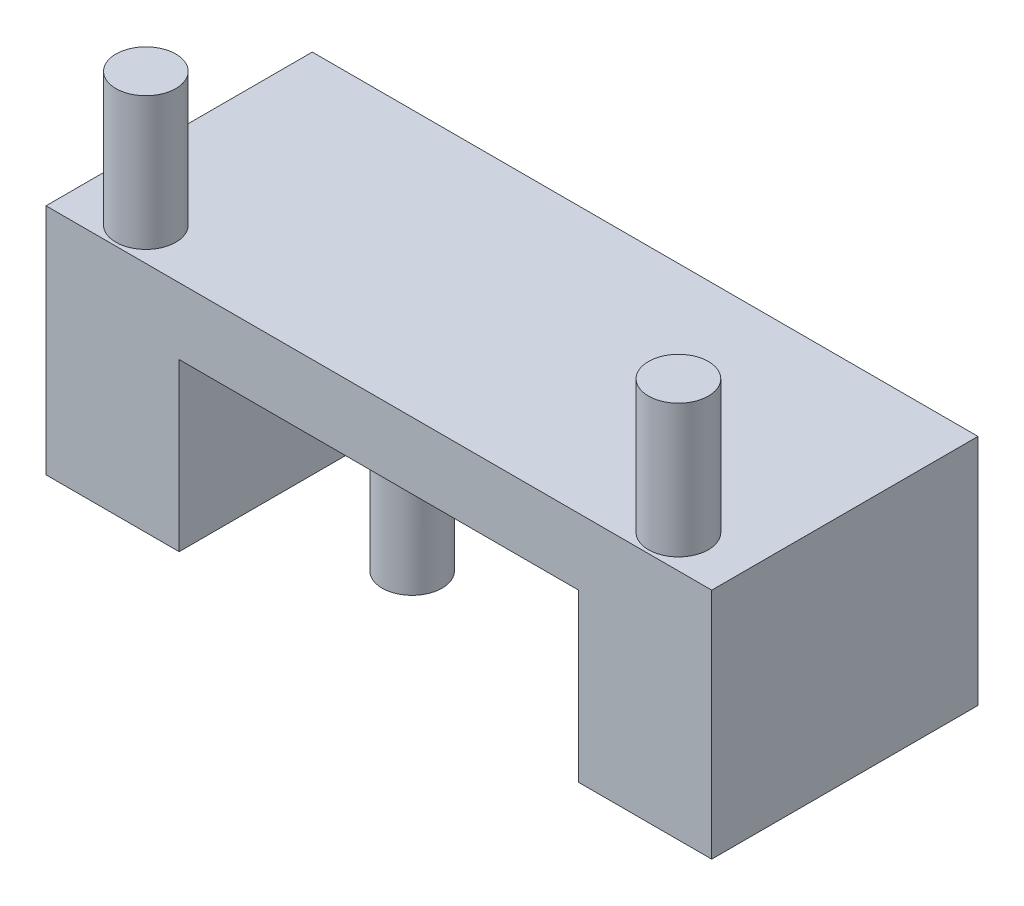
ISO-10303-21;
HEADER;
FILE_DESCRIPTION(('STEP AP214'),'2;1');
FILE_NAME('part.step','',(''),(''),'','','');
FILE_SCHEMA(('AUTOMOTIVE_DESIGN { 1 0 10303 214 1 1 1 1 }'));
ENDSEC;
DATA;
#1=APPLICATION_CONTEXT('core data for automotive mechanical design processes');
#2=APPLICATION_PROTOCOL_DEFINITION('international standard','automotive_design',2000,#1);
#3=PRODUCT_CONTEXT('',#1,'mechanical');
#4=PRODUCT('Part','Part','',(#3));
#5=PRODUCT_RELATED_PRODUCT_CATEGORY('part','',(#4));
#6=PRODUCT_DEFINITION_FORMATION('','',#4);
#7=PRODUCT_DEFINITION_CONTEXT('part definition',#1,'design');
#8=PRODUCT_DEFINITION('design','',#6,#7);
#9=PRODUCT_DEFINITION_SHAPE('','',#8);
#10=(LENGTH_UNIT() NAMED_UNIT(*) SI_UNIT(.MILLI.,.METRE.));
#11=(NAMED_UNIT(*) PLANE_ANGLE_UNIT() SI_UNIT($,.RADIAN.));
#12=(NAMED_UNIT(*) SI_UNIT($,.STERADIAN.) SOLID_ANGLE_UNIT());
#13=UNCERTAINTY_MEASURE_WITH_UNIT(LENGTH_MEASURE(1.E-05),#10,'distance_accuracy_value','');
#14=(GEOMETRIC_REPRESENTATION_CONTEXT(3) GLOBAL_UNCERTAINTY_ASSIGNED_CONTEXT((#13)) GLOBAL_UNIT_ASSIGNED_CONTEXT((#10,
#11,#12)) REPRESENTATION_CONTEXT('',''));
#15=CARTESIAN_POINT('',(0.,0.,0.));
#16=DIRECTION('',(0.,0.,1.));
#17=DIRECTION('',(1.,0.,0.));
#18=AXIS2_PLACEMENT_3D('',#15,#16,#17);
#19=CARTESIAN_POINT('',(0.,0.,0.));
#20=DIRECTION('',(0.,1.,0.));
#21=DIRECTION('',(0.,0.,0.999999999999999));
#22=AXIS2_PLACEMENT_3D('',#19,#20,#21);
#23=PLANE('',#22);
#24=DIRECTION('',(-1.,0.,0.));
#25=VECTOR('',#24,1.);
#26=CARTESIAN_POINT('',(0.,0.,0.));
#27=LINE('',#26,#25);
#28=CARTESIAN_POINT('',(5.08000000000007,0.,0.));
#29=VERTEX_POINT('',#28);
#30=CARTESIAN_POINT('',(0.,0.,0.));
#31=VERTEX_POINT('',#30);
#32=EDGE_CURVE('E85',#29,#31,#27,.T.);
#33=ORIENTED_EDGE('',*,*,#32,.F.);
#34=DIRECTION('',(0.,0.,0.999999999999999));
#35=VECTOR('',#34,1.);
#36=CARTESIAN_POINT('',(5.08000000000007,0.,0.));
#37=LINE('',#36,#35);
#38=CARTESIAN_POINT('',(5.08000000000007,0.,10.16));
#39=VERTEX_POINT('',#38);
#40=EDGE_CURVE('E171',#29,#39,#37,.T.);
#41=ORIENTED_EDGE('',*,*,#40,.T.);
#42=DIRECTION('',(1.,0.,0.));
#43=VECTOR('',#42,1.);
#44=CARTESIAN_POINT('',(0.,0.,10.16));
#45=LINE('',#44,#43);
#46=CARTESIAN_POINT('',(0.,0.,10.16));
#47=VERTEX_POINT('',#46);
#48=EDGE_CURVE('E135',#47,#39,#45,.T.);
#49=ORIENTED_EDGE('',*,*,#48,.F.);
#50=DIRECTION('',(0.,0.,0.999999999999999));
#51=VECTOR('',#50,1.);
#52=CARTESIAN_POINT('',(0.,0.,0.));
#53=LINE('',#52,#51);
#54=EDGE_CURVE('E151',#31,#47,#53,.T.);
#55=ORIENTED_EDGE('',*,*,#54,.F.);
#56=EDGE_LOOP('',(#33,#41,#49,#55));
#57=FACE_BOUND('',#56,.T.);
#58=ADVANCED_FACE('F40',(#57),#23,.F.);
#59=CARTESIAN_POINT('',(0.,8.89000000000012,1.38777878078145E-13));
#60=DIRECTION('',(1.,0.,0.));
#61=DIRECTION('',(0.,0.,-0.999999999999999));
#62=AXIS2_PLACEMENT_3D('',#59,#60,#61);
#63=PLANE('',#62);
#64=ORIENTED_EDGE('',*,*,#54,.T.);
#65=DIRECTION('',(0.,-1.,0.));
#66=VECTOR('',#65,1.);
#67=CARTESIAN_POINT('',(0.,8.8900000000004,10.16));
#68=LINE('',#67,#66);
#69=CARTESIAN_POINT('',(0.,8.8900000000004,10.16));
#70=VERTEX_POINT('',#69);
#71=EDGE_CURVE('E167',#70,#47,#68,.T.);
#72=ORIENTED_EDGE('',*,*,#71,.F.);
#73=DIRECTION('',(0.,0.,0.999999999999999));
#74=VECTOR('',#73,1.);
#75=CARTESIAN_POINT('',(0.,8.89000000000012,1.38777878078145E-13));
#76=LINE('',#75,#74);
#77=CARTESIAN_POINT('',(0.,8.89000000000012,1.38777878078145E-13));
#78=VERTEX_POINT('',#77);
#79=EDGE_CURVE('E143',#78,#70,#76,.T.);
#80=ORIENTED_EDGE('',*,*,#79,.F.);
#81=DIRECTION('',(0.,-1.,0.));
#82=VECTOR('',#81,1.);
#83=CARTESIAN_POINT('',(0.,8.89000000000012,1.38777878078145E-13));
#84=LINE('',#83,#82);
#85=EDGE_CURVE('E150',#78,#31,#84,.T.);
#86=ORIENTED_EDGE('',*,*,#85,.T.);
#87=EDGE_LOOP('',(#64,#72,#80,#86));
#88=FACE_BOUND('',#87,.T.);
#89=ADVANCED_FACE('F42',(#88),#63,.F.);
#90=CARTESIAN_POINT('',(0.,8.8900000000004,10.16));
#91=DIRECTION('',(0.,0.,-0.999999999999999));
#92=DIRECTION('',(-1.,0.,0.));
#93=AXIS2_PLACEMENT_3D('',#90,#91,#92);
#94=PLANE('',#93);
#95=ORIENTED_EDGE('',*,*,#48,.T.);
#96=DIRECTION('',(0.,1.,0.));
#97=VECTOR('',#96,1.);
#98=CARTESIAN_POINT('',(5.0800000000001,-1.27000000000005,10.1599999999999));
#99=LINE('',#98,#97);
#100=CARTESIAN_POINT('',(5.08000000000006,6.34999999999999,10.1600000000001));
#101=VERTEX_POINT('',#100);
#102=EDGE_CURVE('E128',#39,#101,#99,.T.);
#103=ORIENTED_EDGE('',*,*,#102,.T.);
#104=DIRECTION('',(1.,0.,0.));
#105=VECTOR('',#104,1.);
#106=CARTESIAN_POINT('',(5.08000000000006,6.34999999999999,10.1600000000001));
#107=LINE('',#106,#105);
#108=CARTESIAN_POINT('',(20.3200000000001,6.35000000000002,10.16));
#109=VERTEX_POINT('',#108);
#110=EDGE_CURVE('E116',#101,#109,#107,.T.);
#111=ORIENTED_EDGE('',*,*,#110,.T.);
#112=DIRECTION('',(0.,1.,0.));
#113=VECTOR('',#112,1.);
#114=CARTESIAN_POINT('',(20.3200000000001,-1.27000000000022,10.16));
#115=LINE('',#114,#113);
#116=CARTESIAN_POINT('',(20.3200000000001,0.,10.1600000000001));
#117=VERTEX_POINT('',#116);
#118=EDGE_CURVE('E136',#117,#109,#115,.T.);
#119=ORIENTED_EDGE('',*,*,#118,.F.);
#120=CARTESIAN_POINT('',(25.4000000000002,2.4980018054066E-13,10.16));
#121=VERTEX_POINT('',#120);
#122=EDGE_CURVE('E154',#117,#121,#45,.T.);
#123=ORIENTED_EDGE('',*,*,#122,.T.);
#124=DIRECTION('',(0.,-1.,0.));
#125=VECTOR('',#124,1.);
#126=CARTESIAN_POINT('',(25.4000000000001,8.89000000000001,10.16));
#127=LINE('',#126,#125);
#128=CARTESIAN_POINT('',(25.4000000000001,8.89000000000001,10.16));
#129=VERTEX_POINT('',#128);
#130=EDGE_CURVE('E164',#129,#121,#127,.T.);
#131=ORIENTED_EDGE('',*,*,#130,.F.);
#132=DIRECTION('',(1.,0.,0.));
#133=VECTOR('',#132,1.);
#134=CARTESIAN_POINT('',(0.,8.8900000000004,10.16));
#135=LINE('',#134,#133);
#136=EDGE_CURVE('E93',#70,#129,#135,.T.);
#137=ORIENTED_EDGE('',*,*,#136,.F.);
#138=ORIENTED_EDGE('',*,*,#71,.T.);
#139=EDGE_LOOP('',(#95,#103,#111,#119,#123,#131,#137,#138));
#140=FACE_BOUND('',#139,.T.);
#141=ADVANCED_FACE('F134',(#140),#94,.F.);
#142=CARTESIAN_POINT('',(25.4000000000001,8.89000000000015,0.));
#143=DIRECTION('',(-1.,0.,0.));
#144=DIRECTION('',(0.,0.,0.999999999999999));
#145=AXIS2_PLACEMENT_3D('',#142,#143,#144);
#146=PLANE('',#145);
#147=DIRECTION('',(0.,0.,-0.999999999999999));
#148=VECTOR('',#147,1.);
#149=CARTESIAN_POINT('',(25.4000000000001,0.,-1.38777878078145E-13));
#150=LINE('',#149,#148);
#151=CARTESIAN_POINT('',(25.4000000000001,0.,-1.38777878078145E-13));
#152=VERTEX_POINT('',#151);
#153=EDGE_CURVE('E156',#121,#152,#150,.T.);
#154=ORIENTED_EDGE('',*,*,#153,.T.);
#155=DIRECTION('',(0.,-1.,0.));
#156=VECTOR('',#155,1.);
#157=CARTESIAN_POINT('',(25.4000000000001,8.89000000000015,0.));
#158=LINE('',#157,#156);
#159=CARTESIAN_POINT('',(25.4000000000001,8.89000000000015,0.));
#160=VERTEX_POINT('',#159);
#161=EDGE_CURVE('E161',#160,#152,#158,.T.);
#162=ORIENTED_EDGE('',*,*,#161,.F.);
#163=DIRECTION('',(0.,0.,-0.999999999999999));
#164=VECTOR('',#163,1.);
#165=CARTESIAN_POINT('',(25.4000000000001,8.89000000000015,0.));
#166=LINE('',#165,#164);
#167=EDGE_CURVE('E147',#129,#160,#166,.T.);
#168=ORIENTED_EDGE('',*,*,#167,.F.);
#169=ORIENTED_EDGE('',*,*,#130,.T.);
#170=EDGE_LOOP('',(#154,#162,#168,#169));
#171=FACE_BOUND('',#170,.T.);
#172=ADVANCED_FACE('F234',(#171),#146,.F.);
#173=CARTESIAN_POINT('',(0.,8.89000000000012,1.38777878078145E-13));
#174=DIRECTION('',(0.,0.,0.999999999999999));
#175=DIRECTION('',(1.,0.,0.));
#176=AXIS2_PLACEMENT_3D('',#173,#174,#175);
#177=PLANE('',#176);
#178=DIRECTION('',(-1.,0.,0.));
#179=VECTOR('',#178,1.);
#180=CARTESIAN_POINT('',(5.08000000000008,6.35000000000027,0.));
#181=LINE('',#180,#179);
#182=CARTESIAN_POINT('',(20.3200000000001,6.35000000000008,0.));
#183=VERTEX_POINT('',#182);
#184=CARTESIAN_POINT('',(5.08000000000008,6.35000000000027,0.));
#185=VERTEX_POINT('',#184);
#186=EDGE_CURVE('E137',#183,#185,#181,.T.);
#187=ORIENTED_EDGE('',*,*,#186,.T.);
#188=DIRECTION('',(0.,1.,0.));
#189=VECTOR('',#188,1.);
#190=CARTESIAN_POINT('',(5.08000000000008,-1.27000000000002,0.));
#191=LINE('',#190,#189);
#192=EDGE_CURVE('E130',#29,#185,#191,.T.);
#193=ORIENTED_EDGE('',*,*,#192,.F.);
#194=ORIENTED_EDGE('',*,*,#32,.T.);
#195=ORIENTED_EDGE('',*,*,#85,.F.);
#196=DIRECTION('',(-1.,0.,0.));
#197=VECTOR('',#196,1.);
#198=CARTESIAN_POINT('',(0.,8.89000000000012,1.38777878078145E-13));
#199=LINE('',#198,#197);
#200=EDGE_CURVE('E64',#160,#78,#199,.T.);
#201=ORIENTED_EDGE('',*,*,#200,.F.);
#202=ORIENTED_EDGE('',*,*,#161,.T.);
#203=CARTESIAN_POINT('',(20.3200000000001,0.,-1.2490009027033E-13));
#204=VERTEX_POINT('',#203);
#205=EDGE_CURVE('E145',#152,#204,#27,.T.);
#206=ORIENTED_EDGE('',*,*,#205,.T.);
#207=DIRECTION('',(0.,1.,0.));
#208=VECTOR('',#207,1.);
#209=CARTESIAN_POINT('',(20.3200000000001,-1.26999999999991,0.));
#210=LINE('',#209,#208);
#211=EDGE_CURVE('E55',#204,#183,#210,.T.);
#212=ORIENTED_EDGE('',*,*,#211,.T.);
#213=EDGE_LOOP('',(#187,#193,#194,#195,#201,#202,#206,#212));
#214=FACE_BOUND('',#213,.T.);
#215=ADVANCED_FACE('F185',(#214),#177,.F.);
#216=CARTESIAN_POINT('',(0.,8.89000000000012,1.38777878078145E-13));
#217=DIRECTION('',(0.,1.,0.));
#218=DIRECTION('',(0.,0.,0.999999999999999));
#219=AXIS2_PLACEMENT_3D('',#216,#217,#218);
#220=PLANE('',#219);
#221=CARTESIAN_POINT('',(22.8600000000001,8.89000000000012,8.88999999999997));
#222=DIRECTION('',(0.,1.,0.));
#223=DIRECTION('',(0.,0.,0.999999999999999));
#224=AXIS2_PLACEMENT_3D('',#221,#222,#223);
#225=CIRCLE('',#224,1.143);
#226=CARTESIAN_POINT('',(22.8600000000001,8.89000000000012,10.033));
#227=VERTEX_POINT('',#226);
#228=EDGE_CURVE('E48',#227,#227,#225,.T.);
#229=ORIENTED_EDGE('',*,*,#228,.F.);
#230=EDGE_LOOP('',(#229));
#231=FACE_BOUND('',#230,.T.);
#232=CARTESIAN_POINT('',(2.54,8.89000000000026,8.89));
#233=DIRECTION('',(0.,1.,0.));
#234=DIRECTION('',(0.,0.,0.999999999999999));
#235=AXIS2_PLACEMENT_3D('',#232,#233,#234);
#236=CIRCLE('',#235,1.143);
#237=CARTESIAN_POINT('',(2.54,8.89000000000026,10.033));
#238=VERTEX_POINT('',#237);
#239=EDGE_CURVE('E173',#238,#238,#236,.T.);
#240=ORIENTED_EDGE('',*,*,#239,.F.);
#241=EDGE_LOOP('',(#240));
#242=FACE_BOUND('',#241,.T.);
#243=ORIENTED_EDGE('',*,*,#79,.T.);
#244=ORIENTED_EDGE('',*,*,#136,.T.);
#245=ORIENTED_EDGE('',*,*,#167,.T.);
#246=ORIENTED_EDGE('',*,*,#200,.T.);
#247=EDGE_LOOP('',(#243,#244,#245,#246));
#248=FACE_BOUND('',#247,.T.);
#249=ADVANCED_FACE('F181',(#231,#242,#248),#220,.T.);
#250=ORIENTED_EDGE('',*,*,#122,.F.);
#251=DIRECTION('',(0.,0.,-0.999999999999999));
#252=VECTOR('',#251,1.);
#253=CARTESIAN_POINT('',(20.3200000000001,0.,-1.2490009027033E-13));
#254=LINE('',#253,#252);
#255=EDGE_CURVE('E169',#117,#204,#254,.T.);
#256=ORIENTED_EDGE('',*,*,#255,.T.);
#257=ORIENTED_EDGE('',*,*,#205,.F.);
#258=ORIENTED_EDGE('',*,*,#153,.F.);
#259=EDGE_LOOP('',(#250,#256,#257,#258));
#260=FACE_BOUND('',#259,.T.);
#261=ADVANCED_FACE('F184',(#260),#23,.F.);
#262=CARTESIAN_POINT('',(5.0800000000001,-1.27000000000005,10.1599999999999));
#263=DIRECTION('',(-1.,0.,0.));
#264=DIRECTION('',(0.,0.,0.999999999999999));
#265=AXIS2_PLACEMENT_3D('',#262,#263,#264);
#266=PLANE('',#265);
#267=ORIENTED_EDGE('',*,*,#192,.T.);
#268=DIRECTION('',(0.,0.,0.999999999999999));
#269=VECTOR('',#268,1.);
#270=CARTESIAN_POINT('',(5.08000000000006,6.34999999999999,10.1600000000001));
#271=LINE('',#270,#269);
#272=EDGE_CURVE('E120',#185,#101,#271,.T.);
#273=ORIENTED_EDGE('',*,*,#272,.T.);
#274=ORIENTED_EDGE('',*,*,#102,.F.);
#275=ORIENTED_EDGE('',*,*,#40,.F.);
#276=EDGE_LOOP('',(#267,#273,#274,#275));
#277=FACE_BOUND('',#276,.T.);
#278=ADVANCED_FACE('F127',(#277),#266,.F.);
#279=CARTESIAN_POINT('',(20.3200000000001,-1.26999999999991,0.));
#280=DIRECTION('',(1.,0.,0.));
#281=DIRECTION('',(0.,0.,-0.999999999999999));
#282=AXIS2_PLACEMENT_3D('',#279,#280,#281);
#283=PLANE('',#282);
#284=ORIENTED_EDGE('',*,*,#118,.T.);
#285=DIRECTION('',(0.,0.,-0.999999999999999));
#286=VECTOR('',#285,1.);
#287=CARTESIAN_POINT('',(20.3200000000001,6.35000000000008,0.));
#288=LINE('',#287,#286);
#289=EDGE_CURVE('E122',#109,#183,#288,.T.);
#290=ORIENTED_EDGE('',*,*,#289,.T.);
#291=ORIENTED_EDGE('',*,*,#211,.F.);
#292=ORIENTED_EDGE('',*,*,#255,.F.);
#293=EDGE_LOOP('',(#284,#290,#291,#292));
#294=FACE_BOUND('',#293,.T.);
#295=ADVANCED_FACE('F227',(#294),#283,.F.);
#296=CARTESIAN_POINT('',(0.,6.34999999999999,0.));
#297=DIRECTION('',(0.,-1.,0.));
#298=DIRECTION('',(0.,0.,-0.999999999999999));
#299=AXIS2_PLACEMENT_3D('',#296,#297,#298);
#300=PLANE('',#299);
#301=CARTESIAN_POINT('',(12.7000000000001,6.34999999999999,8.89));
#302=DIRECTION('',(0.,-1.,0.));
#303=DIRECTION('',(0.,0.,-0.999999999999999));
#304=AXIS2_PLACEMENT_3D('',#301,#302,#303);
#305=CIRCLE('',#304,1.143);
#306=CARTESIAN_POINT('',(12.7000000000001,6.34999999999999,7.747));
#307=VERTEX_POINT('',#306);
#308=EDGE_CURVE('E11',#307,#307,#305,.T.);
#309=ORIENTED_EDGE('',*,*,#308,.F.);
#310=EDGE_LOOP('',(#309));
#311=FACE_BOUND('',#310,.T.);
#312=ORIENTED_EDGE('',*,*,#272,.F.);
#313=ORIENTED_EDGE('',*,*,#186,.F.);
#314=ORIENTED_EDGE('',*,*,#289,.F.);
#315=ORIENTED_EDGE('',*,*,#110,.F.);
#316=EDGE_LOOP('',(#312,#313,#314,#315));
#317=FACE_BOUND('',#316,.T.);
#318=ADVANCED_FACE('F118',(#311,#317),#300,.T.);
#319=CARTESIAN_POINT('',(2.54000000000003,3.81000000000001,8.89));
#320=DIRECTION('',(0.,1.,0.));
#321=DIRECTION('',(0.,0.,0.999999999999999));
#322=AXIS2_PLACEMENT_3D('',#319,#320,#321);
#323=CYLINDRICAL_SURFACE('',#322,1.143);
#324=ORIENTED_EDGE('',*,*,#239,.T.);
#325=EDGE_LOOP('',(#324));
#326=FACE_BOUND('',#325,.T.);
#327=CARTESIAN_POINT('',(2.54000000000007,13.9700000000003,8.89000000000011));
#328=DIRECTION('',(0.,1.,0.));
#329=DIRECTION('',(0.,0.,0.999999999999999));
#330=AXIS2_PLACEMENT_3D('',#327,#328,#329);
#331=CIRCLE('',#330,1.143);
#332=CARTESIAN_POINT('',(2.54000000000007,13.9700000000003,10.0330000000001));
#333=VERTEX_POINT('',#332);
#334=EDGE_CURVE('E131',#333,#333,#331,.T.);
#335=ORIENTED_EDGE('',*,*,#334,.F.);
#336=EDGE_LOOP('',(#335));
#337=FACE_BOUND('',#336,.T.);
#338=ADVANCED_FACE('F283',(#326,#337),#323,.T.);
#339=CARTESIAN_POINT('',(2.54000000000007,13.9700000000003,8.89000000000011));
#340=DIRECTION('',(0.,1.,0.));
#341=DIRECTION('',(0.,0.,0.999999999999999));
#342=AXIS2_PLACEMENT_3D('',#339,#340,#341);
#343=PLANE('',#342);
#344=ORIENTED_EDGE('',*,*,#334,.T.);
#345=EDGE_LOOP('',(#344));
#346=FACE_BOUND('',#345,.T.);
#347=ADVANCED_FACE('F293',(#346),#343,.T.);
#348=CARTESIAN_POINT('',(22.8600000000001,3.81000000000029,8.89000000000008));
#349=DIRECTION('',(0.,1.,0.));
#350=DIRECTION('',(0.,0.,0.999999999999999));
#351=AXIS2_PLACEMENT_3D('',#348,#349,#350);
#352=CYLINDRICAL_SURFACE('',#351,1.143);
#353=ORIENTED_EDGE('',*,*,#228,.T.);
#354=EDGE_LOOP('',(#353));
#355=FACE_BOUND('',#354,.T.);
#356=CARTESIAN_POINT('',(22.8600000000001,13.9700000000002,8.89000000000002));
#357=DIRECTION('',(0.,1.,0.));
#358=DIRECTION('',(0.,0.,0.999999999999999));
#359=AXIS2_PLACEMENT_3D('',#356,#357,#358);
#360=CIRCLE('',#359,1.143);
#361=CARTESIAN_POINT('',(22.8600000000001,13.9700000000002,10.033));
#362=VERTEX_POINT('',#361);
#363=EDGE_CURVE('E198',#362,#362,#360,.T.);
#364=ORIENTED_EDGE('',*,*,#363,.F.);
#365=EDGE_LOOP('',(#364));
#366=FACE_BOUND('',#365,.T.);
#367=ADVANCED_FACE('F178',(#355,#366),#352,.T.);
#368=CARTESIAN_POINT('',(22.8600000000001,13.9700000000002,8.89000000000002));
#369=DIRECTION('',(0.,1.,0.));
#370=DIRECTION('',(0.,0.,0.999999999999999));
#371=AXIS2_PLACEMENT_3D('',#368,#369,#370);
#372=PLANE('',#371);
#373=ORIENTED_EDGE('',*,*,#363,.T.);
#374=EDGE_LOOP('',(#373));
#375=FACE_BOUND('',#374,.T.);
#376=ADVANCED_FACE('F213',(#375),#372,.T.);
#377=CARTESIAN_POINT('',(12.7000000000001,2.53999999999999,8.88999999999997));
#378=DIRECTION('',(0.,1.,0.));
#379=DIRECTION('',(0.,0.,0.999999999999999));
#380=AXIS2_PLACEMENT_3D('',#377,#378,#379);
#381=CYLINDRICAL_SURFACE('',#380,1.143);
#382=ORIENTED_EDGE('',*,*,#308,.T.);
#383=EDGE_LOOP('',(#382));
#384=FACE_BOUND('',#383,.T.);
#385=CARTESIAN_POINT('',(12.7000000000001,2.53999999999999,8.88999999999997));
#386=DIRECTION('',(0.,1.,0.));
#387=DIRECTION('',(0.,0.,0.999999999999999));
#388=AXIS2_PLACEMENT_3D('',#385,#386,#387);
#389=CIRCLE('',#388,1.143);
#390=CARTESIAN_POINT('',(12.7000000000001,2.53999999999999,10.033));
#391=VERTEX_POINT('',#390);
#392=EDGE_CURVE('E201',#391,#391,#389,.T.);
#393=ORIENTED_EDGE('',*,*,#392,.T.);
#394=EDGE_LOOP('',(#393));
#395=FACE_BOUND('',#394,.T.);
#396=ADVANCED_FACE('F205',(#384,#395),#381,.T.);
#397=CARTESIAN_POINT('',(12.7000000000001,2.53999999999999,8.88999999999997));
#398=DIRECTION('',(0.,1.,0.));
#399=DIRECTION('',(0.,0.,0.999999999999999));
#400=AXIS2_PLACEMENT_3D('',#397,#398,#399);
#401=PLANE('',#400);
#402=ORIENTED_EDGE('',*,*,#392,.F.);
#403=EDGE_LOOP('',(#402));
#404=FACE_BOUND('',#403,.T.);
#405=ADVANCED_FACE('F207',(#404),#401,.F.);
#406=CLOSED_SHELL('',(#58,#89,#141,#172,#215,#249,#261,#278,#295,#318,#338,#347,#367,#376,#396,#405));
#407=MANIFOLD_SOLID_BREP('B2',#406);
#408=ADVANCED_BREP_SHAPE_REPRESENTATION('',(#18,#407),#14);
#409=SHAPE_DEFINITION_REPRESENTATION(#9,#408);
ENDSEC;
END-ISO-10303-21;
